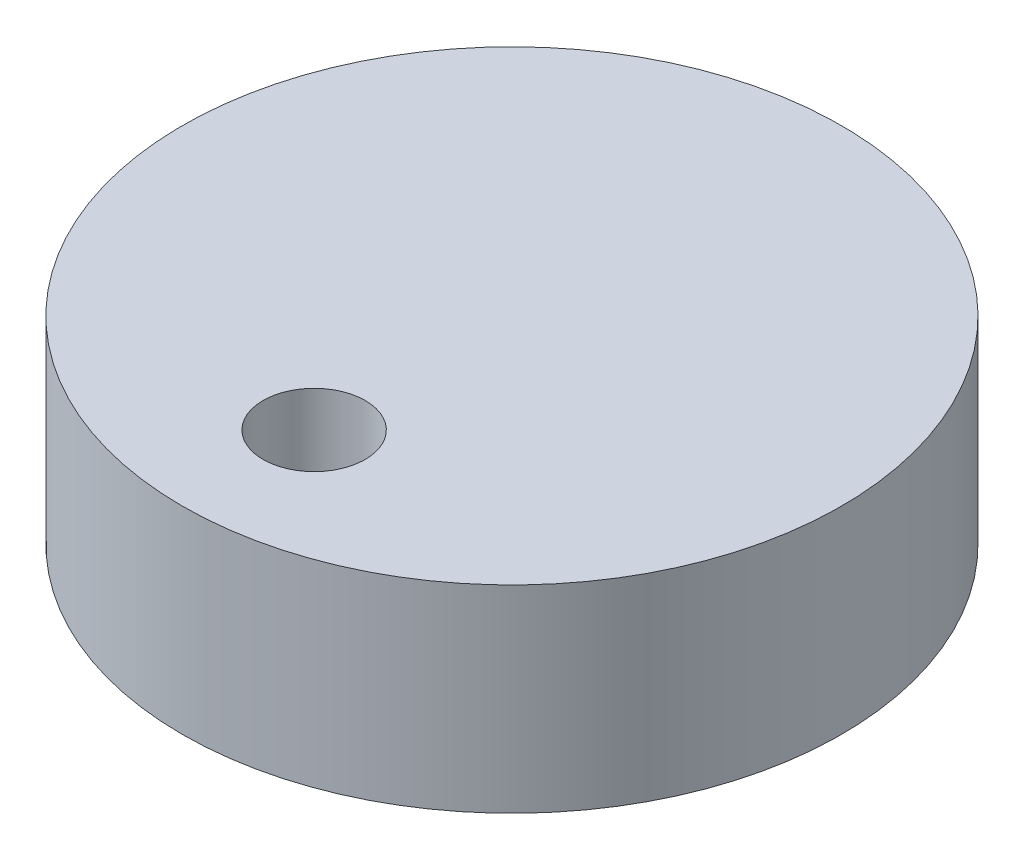
ISO-10303-21;
HEADER;
FILE_DESCRIPTION(('STEP AP214'),'2;1');
FILE_NAME('part.step','',(''),(''),'','','');
FILE_SCHEMA(('AUTOMOTIVE_DESIGN { 1 0 10303 214 1 1 1 1 }'));
ENDSEC;
DATA;
#1=APPLICATION_CONTEXT('core data for automotive mechanical design processes');
#2=APPLICATION_PROTOCOL_DEFINITION('international standard','automotive_design',2000,#1);
#3=PRODUCT_CONTEXT('',#1,'mechanical');
#4=PRODUCT('Part','Part','',(#3));
#5=PRODUCT_RELATED_PRODUCT_CATEGORY('part','',(#4));
#6=PRODUCT_DEFINITION_FORMATION('','',#4);
#7=PRODUCT_DEFINITION_CONTEXT('part definition',#1,'design');
#8=PRODUCT_DEFINITION('design','',#6,#7);
#9=PRODUCT_DEFINITION_SHAPE('','',#8);
#10=(LENGTH_UNIT() NAMED_UNIT(*) SI_UNIT(.MILLI.,.METRE.));
#11=(NAMED_UNIT(*) PLANE_ANGLE_UNIT() SI_UNIT($,.RADIAN.));
#12=(NAMED_UNIT(*) SI_UNIT($,.STERADIAN.) SOLID_ANGLE_UNIT());
#13=UNCERTAINTY_MEASURE_WITH_UNIT(LENGTH_MEASURE(1.E-05),#10,'distance_accuracy_value','');
#14=(GEOMETRIC_REPRESENTATION_CONTEXT(3) GLOBAL_UNCERTAINTY_ASSIGNED_CONTEXT((#13)) GLOBAL_UNIT_ASSIGNED_CONTEXT((#10,
#11,#12)) REPRESENTATION_CONTEXT('',''));
#15=CARTESIAN_POINT('',(0.,0.,0.));
#16=DIRECTION('',(0.,0.,1.));
#17=DIRECTION('',(1.,0.,0.));
#18=AXIS2_PLACEMENT_3D('',#15,#16,#17);
#19=CARTESIAN_POINT('',(0.,6.,0.));
#20=DIRECTION('',(0.,-1.,0.));
#21=DIRECTION('',(0.,0.,-1.));
#22=AXIS2_PLACEMENT_3D('',#19,#20,#21);
#23=CYLINDRICAL_SURFACE('',#22,10.);
#24=CARTESIAN_POINT('',(0.,6.,0.));
#25=DIRECTION('',(0.,1.,0.));
#26=DIRECTION('',(0.,0.,1.));
#27=AXIS2_PLACEMENT_3D('',#24,#25,#26);
#28=CIRCLE('',#27,10.);
#29=CARTESIAN_POINT('',(0.,6.,10.));
#30=VERTEX_POINT('',#29);
#31=EDGE_CURVE('E10',#30,#30,#28,.T.);
#32=ORIENTED_EDGE('',*,*,#31,.F.);
#33=EDGE_LOOP('',(#32));
#34=FACE_BOUND('',#33,.T.);
#35=CARTESIAN_POINT('',(0.,0.,0.));
#36=DIRECTION('',(0.,1.,0.));
#37=DIRECTION('',(0.,0.,1.));
#38=AXIS2_PLACEMENT_3D('',#35,#36,#37);
#39=CIRCLE('',#38,10.);
#40=CARTESIAN_POINT('',(0.,0.,10.));
#41=VERTEX_POINT('',#40);
#42=EDGE_CURVE('E46',#41,#41,#39,.T.);
#43=ORIENTED_EDGE('',*,*,#42,.T.);
#44=EDGE_LOOP('',(#43));
#45=FACE_BOUND('',#44,.T.);
#46=ADVANCED_FACE('F43',(#34,#45),#23,.T.);
#47=CARTESIAN_POINT('',(0.,6.,0.));
#48=DIRECTION('',(0.,1.,0.));
#49=DIRECTION('',(0.,0.,1.));
#50=AXIS2_PLACEMENT_3D('',#47,#48,#49);
#51=PLANE('',#50);
#52=CARTESIAN_POINT('',(-0.00235350165667114,6.,5.99935517993799));
#53=DIRECTION('',(0.,-1.,0.));
#54=DIRECTION('',(0.,0.,-1.));
#55=AXIS2_PLACEMENT_3D('',#52,#53,#54);
#56=CIRCLE('',#55,1.55);
#57=CARTESIAN_POINT('',(-0.00235350165667114,6.,4.44935517993799));
#58=VERTEX_POINT('',#57);
#59=EDGE_CURVE('E54',#58,#58,#56,.T.);
#60=ORIENTED_EDGE('',*,*,#59,.T.);
#61=EDGE_LOOP('',(#60));
#62=FACE_BOUND('',#61,.T.);
#63=ORIENTED_EDGE('',*,*,#31,.T.);
#64=EDGE_LOOP('',(#63));
#65=FACE_BOUND('',#64,.T.);
#66=ADVANCED_FACE('F64',(#62,#65),#51,.T.);
#67=CARTESIAN_POINT('',(0.,0.,0.));
#68=DIRECTION('',(0.,1.,0.));
#69=DIRECTION('',(0.,0.,1.));
#70=AXIS2_PLACEMENT_3D('',#67,#68,#69);
#71=PLANE('',#70);
#72=CARTESIAN_POINT('',(-0.00235350165667114,0.,5.99935517993799));
#73=DIRECTION('',(0.,-1.,0.));
#74=DIRECTION('',(0.,0.,-1.));
#75=AXIS2_PLACEMENT_3D('',#72,#73,#74);
#76=CIRCLE('',#75,1.55);
#77=CARTESIAN_POINT('',(-0.00235350165667114,0.,4.44935517993799));
#78=VERTEX_POINT('',#77);
#79=EDGE_CURVE('E60',#78,#78,#76,.T.);
#80=ORIENTED_EDGE('',*,*,#79,.F.);
#81=EDGE_LOOP('',(#80));
#82=FACE_BOUND('',#81,.T.);
#83=ORIENTED_EDGE('',*,*,#42,.F.);
#84=EDGE_LOOP('',(#83));
#85=FACE_BOUND('',#84,.T.);
#86=ADVANCED_FACE('F68',(#82,#85),#71,.F.);
#87=CARTESIAN_POINT('',(-0.00235350165667114,6.,5.99935517993799));
#88=DIRECTION('',(0.,-1.,0.));
#89=DIRECTION('',(0.,0.,-1.));
#90=AXIS2_PLACEMENT_3D('',#87,#88,#89);
#91=CYLINDRICAL_SURFACE('',#90,1.55);
#92=ORIENTED_EDGE('',*,*,#59,.F.);
#93=EDGE_LOOP('',(#92));
#94=FACE_BOUND('',#93,.T.);
#95=ORIENTED_EDGE('',*,*,#79,.T.);
#96=EDGE_LOOP('',(#95));
#97=FACE_BOUND('',#96,.T.);
#98=ADVANCED_FACE('F70',(#94,#97),#91,.F.);
#99=CLOSED_SHELL('',(#46,#66,#86,#98));
#100=MANIFOLD_SOLID_BREP('B2',#99);
#101=ADVANCED_BREP_SHAPE_REPRESENTATION('',(#18,#100),#14);
#102=SHAPE_DEFINITION_REPRESENTATION(#9,#101);
ENDSEC;
END-ISO-10303-21;
